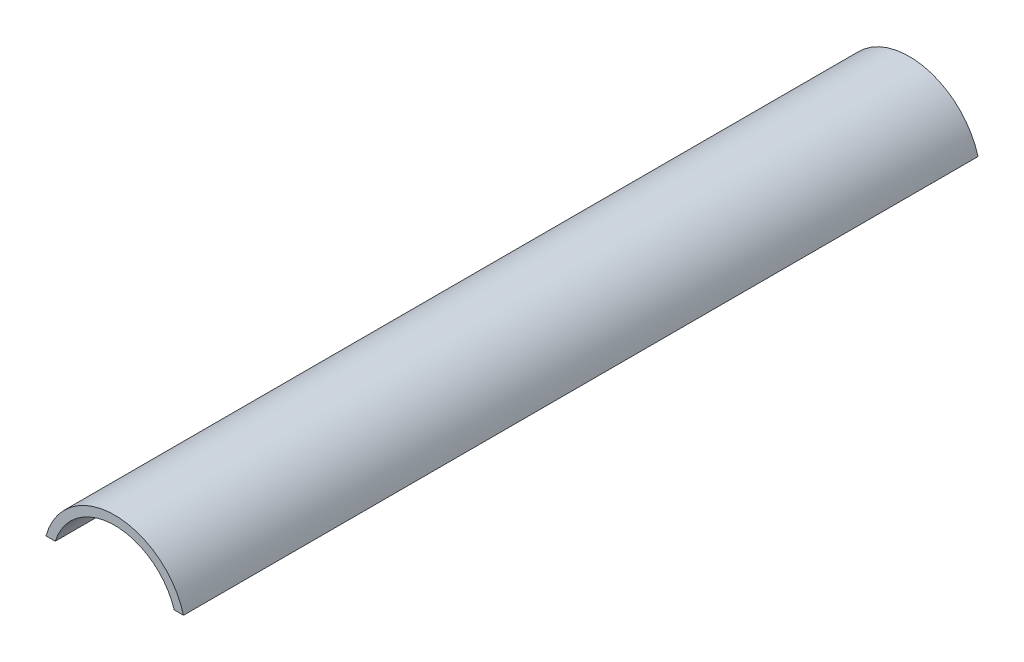
ISO-10303-21;
HEADER;
FILE_DESCRIPTION(('STEP AP214'),'2;1');
FILE_NAME('part.step','',(''),(''),'','','');
FILE_SCHEMA(('AUTOMOTIVE_DESIGN { 1 0 10303 214 1 1 1 1 }'));
ENDSEC;
DATA;
#1=APPLICATION_CONTEXT('core data for automotive mechanical design processes');
#2=APPLICATION_PROTOCOL_DEFINITION('international standard','automotive_design',2000,#1);
#3=PRODUCT_CONTEXT('',#1,'mechanical');
#4=PRODUCT('Part','Part','',(#3));
#5=PRODUCT_RELATED_PRODUCT_CATEGORY('part','',(#4));
#6=PRODUCT_DEFINITION_FORMATION('','',#4);
#7=PRODUCT_DEFINITION_CONTEXT('part definition',#1,'design');
#8=PRODUCT_DEFINITION('design','',#6,#7);
#9=PRODUCT_DEFINITION_SHAPE('','',#8);
#10=(LENGTH_UNIT() NAMED_UNIT(*) SI_UNIT(.MILLI.,.METRE.));
#11=(NAMED_UNIT(*) PLANE_ANGLE_UNIT() SI_UNIT($,.RADIAN.));
#12=(NAMED_UNIT(*) SI_UNIT($,.STERADIAN.) SOLID_ANGLE_UNIT());
#13=UNCERTAINTY_MEASURE_WITH_UNIT(LENGTH_MEASURE(1.E-05),#10,'distance_accuracy_value','');
#14=(GEOMETRIC_REPRESENTATION_CONTEXT(3) GLOBAL_UNCERTAINTY_ASSIGNED_CONTEXT((#13)) GLOBAL_UNIT_ASSIGNED_CONTEXT((#10,
#11,#12)) REPRESENTATION_CONTEXT('',''));
#15=CARTESIAN_POINT('',(0.,0.,0.));
#16=DIRECTION('',(0.,0.,1.));
#17=DIRECTION('',(1.,0.,0.));
#18=AXIS2_PLACEMENT_3D('',#15,#16,#17);
#19=CARTESIAN_POINT('',(0.,0.,141.5));
#20=DIRECTION('',(0.,0.,-1.));
#21=DIRECTION('',(-1.,0.,0.));
#22=AXIS2_PLACEMENT_3D('',#19,#20,#21);
#23=CYLINDRICAL_SURFACE('',#22,12.7);
#24=CARTESIAN_POINT('',(0.,0.,0.));
#25=DIRECTION('',(0.,0.,1.));
#26=DIRECTION('',(1.,0.,0.));
#27=AXIS2_PLACEMENT_3D('',#24,#25,#26);
#28=CIRCLE('',#27,12.7);
#29=CARTESIAN_POINT('',(12.2445715507012,3.37052926700802,0.));
#30=VERTEX_POINT('',#29);
#31=CARTESIAN_POINT('',(-12.2445715507012,3.37052926700802,0.));
#32=VERTEX_POINT('',#31);
#33=EDGE_CURVE('E96',#30,#32,#28,.T.);
#34=ORIENTED_EDGE('',*,*,#33,.T.);
#35=DIRECTION('',(0.,0.,-1.));
#36=VECTOR('',#35,1.);
#37=CARTESIAN_POINT('',(-12.2445715507012,3.37052926700802,141.5));
#38=LINE('',#37,#36);
#39=CARTESIAN_POINT('',(-12.2445715507012,3.37052926700802,141.5));
#40=VERTEX_POINT('',#39);
#41=EDGE_CURVE('E11',#40,#32,#38,.T.);
#42=ORIENTED_EDGE('',*,*,#41,.F.);
#43=CARTESIAN_POINT('',(0.,0.,141.5));
#44=DIRECTION('',(0.,0.,1.));
#45=DIRECTION('',(1.,0.,0.));
#46=AXIS2_PLACEMENT_3D('',#43,#44,#45);
#47=CIRCLE('',#46,12.7);
#48=CARTESIAN_POINT('',(12.2445715507012,3.37052926700802,141.5));
#49=VERTEX_POINT('',#48);
#50=EDGE_CURVE('E84',#49,#40,#47,.T.);
#51=ORIENTED_EDGE('',*,*,#50,.F.);
#52=DIRECTION('',(0.,0.,-1.));
#53=VECTOR('',#52,1.);
#54=CARTESIAN_POINT('',(12.2445715507012,3.37052926700802,141.5));
#55=LINE('',#54,#53);
#56=EDGE_CURVE('E92',#49,#30,#55,.T.);
#57=ORIENTED_EDGE('',*,*,#56,.T.);
#58=EDGE_LOOP('',(#34,#42,#51,#57));
#59=FACE_BOUND('',#58,.T.);
#60=ADVANCED_FACE('F33',(#59),#23,.T.);
#61=CARTESIAN_POINT('',(-12.2445715507012,3.37052926700802,141.5));
#62=DIRECTION('',(0.,1.,0.));
#63=DIRECTION('',(0.,0.,1.));
#64=AXIS2_PLACEMENT_3D('',#61,#62,#63);
#65=PLANE('',#64);
#66=DIRECTION('',(1.,0.,0.));
#67=VECTOR('',#66,1.);
#68=CARTESIAN_POINT('',(-12.2445715507012,3.37052926700802,0.));
#69=LINE('',#68,#67);
#70=CARTESIAN_POINT('',(-10.5968831483716,3.37052926700802,0.));
#71=VERTEX_POINT('',#70);
#72=EDGE_CURVE('E88',#32,#71,#69,.T.);
#73=ORIENTED_EDGE('',*,*,#72,.T.);
#74=DIRECTION('',(0.,0.,-1.));
#75=VECTOR('',#74,1.);
#76=CARTESIAN_POINT('',(-10.5968831483716,3.37052926700802,141.5));
#77=LINE('',#76,#75);
#78=CARTESIAN_POINT('',(-10.5968831483716,3.37052926700802,141.5));
#79=VERTEX_POINT('',#78);
#80=EDGE_CURVE('E41',#79,#71,#77,.T.);
#81=ORIENTED_EDGE('',*,*,#80,.F.);
#82=DIRECTION('',(1.,0.,0.));
#83=VECTOR('',#82,1.);
#84=CARTESIAN_POINT('',(-12.2445715507012,3.37052926700802,141.5));
#85=LINE('',#84,#83);
#86=EDGE_CURVE('E79',#40,#79,#85,.T.);
#87=ORIENTED_EDGE('',*,*,#86,.F.);
#88=ORIENTED_EDGE('',*,*,#41,.T.);
#89=EDGE_LOOP('',(#73,#81,#87,#88));
#90=FACE_BOUND('',#89,.T.);
#91=ADVANCED_FACE('F87',(#90),#65,.F.);
#92=CARTESIAN_POINT('',(0.,0.,141.5));
#93=DIRECTION('',(0.,0.,-1.));
#94=DIRECTION('',(-1.,0.,0.));
#95=AXIS2_PLACEMENT_3D('',#92,#93,#94);
#96=CYLINDRICAL_SURFACE('',#95,11.12);
#97=CARTESIAN_POINT('',(0.,0.,0.));
#98=DIRECTION('',(0.,0.,-1.));
#99=DIRECTION('',(1.,0.,0.));
#100=AXIS2_PLACEMENT_3D('',#97,#98,#99);
#101=CIRCLE('',#100,11.12);
#102=CARTESIAN_POINT('',(10.5968831483716,3.37052926700802,0.));
#103=VERTEX_POINT('',#102);
#104=EDGE_CURVE('E66',#71,#103,#101,.T.);
#105=ORIENTED_EDGE('',*,*,#104,.T.);
#106=DIRECTION('',(0.,0.,-1.));
#107=VECTOR('',#106,1.);
#108=CARTESIAN_POINT('',(10.5968831483716,3.37052926700802,141.5));
#109=LINE('',#108,#107);
#110=CARTESIAN_POINT('',(10.5968831483716,3.37052926700802,141.5));
#111=VERTEX_POINT('',#110);
#112=EDGE_CURVE('E89',#111,#103,#109,.T.);
#113=ORIENTED_EDGE('',*,*,#112,.F.);
#114=CARTESIAN_POINT('',(0.,0.,141.5));
#115=DIRECTION('',(0.,0.,-1.));
#116=DIRECTION('',(1.,0.,0.));
#117=AXIS2_PLACEMENT_3D('',#114,#115,#116);
#118=CIRCLE('',#117,11.12);
#119=EDGE_CURVE('E82',#79,#111,#118,.T.);
#120=ORIENTED_EDGE('',*,*,#119,.F.);
#121=ORIENTED_EDGE('',*,*,#80,.T.);
#122=EDGE_LOOP('',(#105,#113,#120,#121));
#123=FACE_BOUND('',#122,.T.);
#124=ADVANCED_FACE('F90',(#123),#96,.F.);
#125=CARTESIAN_POINT('',(10.5968831483716,3.37052926700802,141.5));
#126=DIRECTION('',(0.,1.,0.));
#127=DIRECTION('',(0.,0.,1.));
#128=AXIS2_PLACEMENT_3D('',#125,#126,#127);
#129=PLANE('',#128);
#130=DIRECTION('',(1.,0.,0.));
#131=VECTOR('',#130,1.);
#132=CARTESIAN_POINT('',(10.5968831483716,3.37052926700802,0.));
#133=LINE('',#132,#131);
#134=EDGE_CURVE('E72',#103,#30,#133,.T.);
#135=ORIENTED_EDGE('',*,*,#134,.T.);
#136=ORIENTED_EDGE('',*,*,#56,.F.);
#137=DIRECTION('',(1.,0.,0.));
#138=VECTOR('',#137,1.);
#139=CARTESIAN_POINT('',(10.5968831483716,3.37052926700802,141.5));
#140=LINE('',#139,#138);
#141=EDGE_CURVE('E49',#111,#49,#140,.T.);
#142=ORIENTED_EDGE('',*,*,#141,.F.);
#143=ORIENTED_EDGE('',*,*,#112,.T.);
#144=EDGE_LOOP('',(#135,#136,#142,#143));
#145=FACE_BOUND('',#144,.T.);
#146=ADVANCED_FACE('F103',(#145),#129,.F.);
#147=CARTESIAN_POINT('',(0.,0.,141.5));
#148=DIRECTION('',(0.,0.,1.));
#149=DIRECTION('',(1.,0.,0.));
#150=AXIS2_PLACEMENT_3D('',#147,#148,#149);
#151=PLANE('',#150);
#152=ORIENTED_EDGE('',*,*,#50,.T.);
#153=ORIENTED_EDGE('',*,*,#86,.T.);
#154=ORIENTED_EDGE('',*,*,#119,.T.);
#155=ORIENTED_EDGE('',*,*,#141,.T.);
#156=EDGE_LOOP('',(#152,#153,#154,#155));
#157=FACE_BOUND('',#156,.T.);
#158=ADVANCED_FACE('F80',(#157),#151,.T.);
#159=CARTESIAN_POINT('',(0.,0.,0.));
#160=DIRECTION('',(0.,0.,1.));
#161=DIRECTION('',(1.,0.,0.));
#162=AXIS2_PLACEMENT_3D('',#159,#160,#161);
#163=PLANE('',#162);
#164=ORIENTED_EDGE('',*,*,#33,.F.);
#165=ORIENTED_EDGE('',*,*,#134,.F.);
#166=ORIENTED_EDGE('',*,*,#104,.F.);
#167=ORIENTED_EDGE('',*,*,#72,.F.);
#168=EDGE_LOOP('',(#164,#165,#166,#167));
#169=FACE_BOUND('',#168,.T.);
#170=ADVANCED_FACE('F106',(#169),#163,.F.);
#171=CLOSED_SHELL('',(#60,#91,#124,#146,#158,#170));
#172=MANIFOLD_SOLID_BREP('B2',#171);
#173=ADVANCED_BREP_SHAPE_REPRESENTATION('',(#18,#172),#14);
#174=SHAPE_DEFINITION_REPRESENTATION(#9,#173);
ENDSEC;
END-ISO-10303-21;
